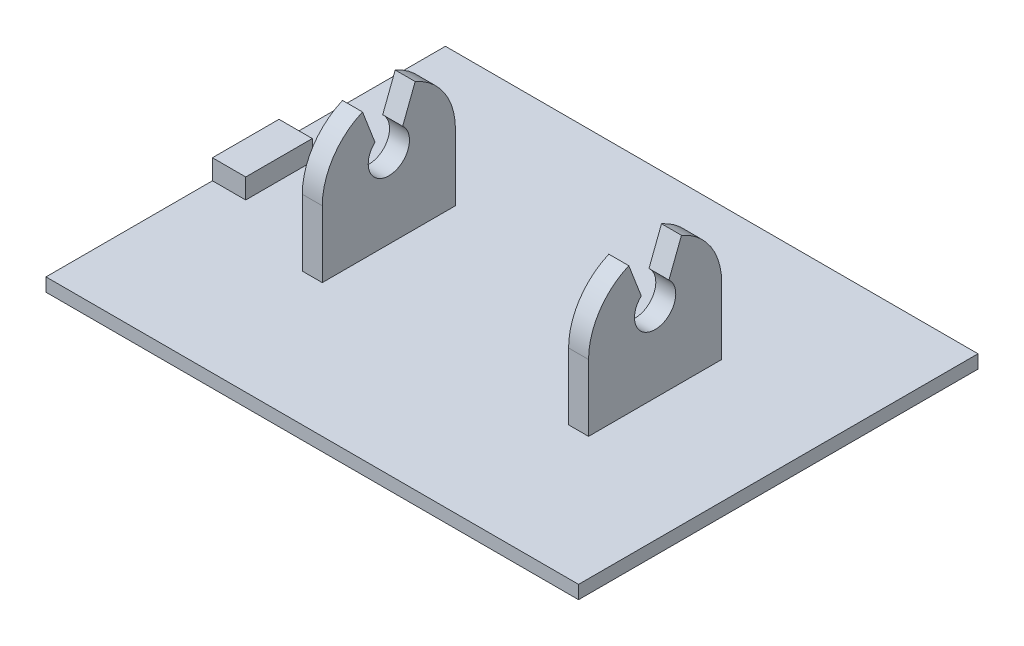
ISO-10303-21;
HEADER;
FILE_DESCRIPTION(('STEP AP214'),'2;1');
FILE_NAME('part.step','',(''),(''),'','','');
FILE_SCHEMA(('AUTOMOTIVE_DESIGN { 1 0 10303 214 1 1 1 1 }'));
ENDSEC;
DATA;
#1=APPLICATION_CONTEXT('core data for automotive mechanical design processes');
#2=APPLICATION_PROTOCOL_DEFINITION('international standard','automotive_design',2000,#1);
#3=PRODUCT_CONTEXT('',#1,'mechanical');
#4=PRODUCT('Part','Part','',(#3));
#5=PRODUCT_RELATED_PRODUCT_CATEGORY('part','',(#4));
#6=PRODUCT_DEFINITION_FORMATION('','',#4);
#7=PRODUCT_DEFINITION_CONTEXT('part definition',#1,'design');
#8=PRODUCT_DEFINITION('design','',#6,#7);
#9=PRODUCT_DEFINITION_SHAPE('','',#8);
#10=(LENGTH_UNIT() NAMED_UNIT(*) SI_UNIT(.MILLI.,.METRE.));
#11=(NAMED_UNIT(*) PLANE_ANGLE_UNIT() SI_UNIT($,.RADIAN.));
#12=(NAMED_UNIT(*) SI_UNIT($,.STERADIAN.) SOLID_ANGLE_UNIT());
#13=UNCERTAINTY_MEASURE_WITH_UNIT(LENGTH_MEASURE(1.E-05),#10,'distance_accuracy_value','');
#14=(GEOMETRIC_REPRESENTATION_CONTEXT(3) GLOBAL_UNCERTAINTY_ASSIGNED_CONTEXT((#13)) GLOBAL_UNIT_ASSIGNED_CONTEXT((#10,
#11,#12)) REPRESENTATION_CONTEXT('',''));
#15=CARTESIAN_POINT('',(0.,0.,0.));
#16=DIRECTION('',(0.,0.,1.));
#17=DIRECTION('',(1.,0.,0.));
#18=AXIS2_PLACEMENT_3D('',#15,#16,#17);
#19=CARTESIAN_POINT('',(0.,2.,0.));
#20=DIRECTION('',(0.,-1.,0.));
#21=DIRECTION('',(0.,0.,-1.));
#22=AXIS2_PLACEMENT_3D('',#19,#20,#21);
#23=PLANE('',#22);
#24=DIRECTION('',(-1.,0.,0.));
#25=VECTOR('',#24,1.);
#26=CARTESIAN_POINT('',(21.5,2.,-10.));
#27=LINE('',#26,#25);
#28=CARTESIAN_POINT('',(21.5,2.,-10.));
#29=VERTEX_POINT('',#28);
#30=CARTESIAN_POINT('',(18.5,2.,-10.));
#31=VERTEX_POINT('',#30);
#32=EDGE_CURVE('E251',#29,#31,#27,.T.);
#33=ORIENTED_EDGE('',*,*,#32,.F.);
#34=DIRECTION('',(0.,0.,1.));
#35=VECTOR('',#34,1.);
#36=CARTESIAN_POINT('',(21.5,2.,-10.));
#37=LINE('',#36,#35);
#38=CARTESIAN_POINT('',(21.5,2.,10.));
#39=VERTEX_POINT('',#38);
#40=EDGE_CURVE('E254',#29,#39,#37,.T.);
#41=ORIENTED_EDGE('',*,*,#40,.T.);
#42=DIRECTION('',(-1.,0.,0.));
#43=VECTOR('',#42,1.);
#44=CARTESIAN_POINT('',(21.5,2.,10.));
#45=LINE('',#44,#43);
#46=CARTESIAN_POINT('',(18.5,2.,10.));
#47=VERTEX_POINT('',#46);
#48=EDGE_CURVE('E257',#39,#47,#45,.T.);
#49=ORIENTED_EDGE('',*,*,#48,.T.);
#50=DIRECTION('',(0.,0.,1.));
#51=VECTOR('',#50,1.);
#52=CARTESIAN_POINT('',(18.5,2.,-10.));
#53=LINE('',#52,#51);
#54=EDGE_CURVE('E260',#31,#47,#53,.T.);
#55=ORIENTED_EDGE('',*,*,#54,.F.);
#56=EDGE_LOOP('',(#33,#41,#49,#55));
#57=FACE_BOUND('',#56,.T.);
#58=DIRECTION('',(0.,0.,1.));
#59=VECTOR('',#58,1.);
#60=CARTESIAN_POINT('',(-21.5,2.,-10.));
#61=LINE('',#60,#59);
#62=CARTESIAN_POINT('',(-21.5,2.,-10.));
#63=VERTEX_POINT('',#62);
#64=CARTESIAN_POINT('',(-21.5,2.,10.));
#65=VERTEX_POINT('',#64);
#66=EDGE_CURVE('E306',#63,#65,#61,.T.);
#67=ORIENTED_EDGE('',*,*,#66,.F.);
#68=DIRECTION('',(1.,0.,0.));
#69=VECTOR('',#68,1.);
#70=CARTESIAN_POINT('',(-21.5,2.,-10.));
#71=LINE('',#70,#69);
#72=CARTESIAN_POINT('',(-18.5,2.,-10.));
#73=VERTEX_POINT('',#72);
#74=EDGE_CURVE('E297',#63,#73,#71,.T.);
#75=ORIENTED_EDGE('',*,*,#74,.T.);
#76=DIRECTION('',(0.,0.,1.));
#77=VECTOR('',#76,1.);
#78=CARTESIAN_POINT('',(-18.5,2.,-10.));
#79=LINE('',#78,#77);
#80=CARTESIAN_POINT('',(-18.5,2.,10.));
#81=VERTEX_POINT('',#80);
#82=EDGE_CURVE('E300',#73,#81,#79,.T.);
#83=ORIENTED_EDGE('',*,*,#82,.T.);
#84=DIRECTION('',(1.,0.,0.));
#85=VECTOR('',#84,1.);
#86=CARTESIAN_POINT('',(-21.5,2.,10.));
#87=LINE('',#86,#85);
#88=EDGE_CURVE('E303',#65,#81,#87,.T.);
#89=ORIENTED_EDGE('',*,*,#88,.F.);
#90=EDGE_LOOP('',(#67,#75,#83,#89));
#91=FACE_BOUND('',#90,.T.);
#92=DIRECTION('',(1.,0.,0.));
#93=VECTOR('',#92,1.);
#94=CARTESIAN_POINT('',(-40.,2.,5.));
#95=LINE('',#94,#93);
#96=CARTESIAN_POINT('',(-40.,2.,5.));
#97=VERTEX_POINT('',#96);
#98=CARTESIAN_POINT('',(-35.,2.,5.));
#99=VERTEX_POINT('',#98);
#100=EDGE_CURVE('E483',#97,#99,#95,.T.);
#101=ORIENTED_EDGE('',*,*,#100,.F.);
#102=DIRECTION('',(0.,0.,-1.));
#103=VECTOR('',#102,1.);
#104=CARTESIAN_POINT('',(-40.,2.,30.));
#105=LINE('',#104,#103);
#106=CARTESIAN_POINT('',(-40.,2.,30.));
#107=VERTEX_POINT('',#106);
#108=EDGE_CURVE('E221',#107,#97,#105,.T.);
#109=ORIENTED_EDGE('',*,*,#108,.F.);
#110=DIRECTION('',(-1.,0.,0.));
#111=VECTOR('',#110,1.);
#112=CARTESIAN_POINT('',(40.,2.,30.));
#113=LINE('',#112,#111);
#114=CARTESIAN_POINT('',(40.,2.,30.));
#115=VERTEX_POINT('',#114);
#116=EDGE_CURVE('E318',#115,#107,#113,.T.);
#117=ORIENTED_EDGE('',*,*,#116,.F.);
#118=DIRECTION('',(0.,0.,-1.));
#119=VECTOR('',#118,1.);
#120=CARTESIAN_POINT('',(40.,2.,30.));
#121=LINE('',#120,#119);
#122=CARTESIAN_POINT('',(40.,2.,-30.));
#123=VERTEX_POINT('',#122);
#124=EDGE_CURVE('E327',#115,#123,#121,.T.);
#125=ORIENTED_EDGE('',*,*,#124,.T.);
#126=DIRECTION('',(-1.,0.,0.));
#127=VECTOR('',#126,1.);
#128=CARTESIAN_POINT('',(40.,2.,-30.));
#129=LINE('',#128,#127);
#130=CARTESIAN_POINT('',(-40.,2.,-30.));
#131=VERTEX_POINT('',#130);
#132=EDGE_CURVE('E324',#123,#131,#129,.T.);
#133=ORIENTED_EDGE('',*,*,#132,.T.);
#134=CARTESIAN_POINT('',(-40.,2.,-5.));
#135=VERTEX_POINT('',#134);
#136=EDGE_CURVE('E321',#135,#131,#105,.T.);
#137=ORIENTED_EDGE('',*,*,#136,.F.);
#138=DIRECTION('',(1.,0.,0.));
#139=VECTOR('',#138,1.);
#140=CARTESIAN_POINT('',(-40.,2.,-5.));
#141=LINE('',#140,#139);
#142=CARTESIAN_POINT('',(-35.,2.,-5.));
#143=VERTEX_POINT('',#142);
#144=EDGE_CURVE('E51',#135,#143,#141,.T.);
#145=ORIENTED_EDGE('',*,*,#144,.T.);
#146=DIRECTION('',(0.,0.,1.));
#147=VECTOR('',#146,1.);
#148=CARTESIAN_POINT('',(-35.,2.,-5.));
#149=LINE('',#148,#147);
#150=EDGE_CURVE('E486',#143,#99,#149,.T.);
#151=ORIENTED_EDGE('',*,*,#150,.T.);
#152=EDGE_LOOP('',(#101,#109,#117,#125,#133,#137,#145,#151));
#153=FACE_BOUND('',#152,.T.);
#154=ADVANCED_FACE('F35',(#57,#91,#153),#23,.F.);
#155=CARTESIAN_POINT('',(21.5,12.,0.));
#156=DIRECTION('',(-1.,0.,0.));
#157=DIRECTION('',(0.,0.,1.));
#158=AXIS2_PLACEMENT_3D('',#155,#156,#157);
#159=CYLINDRICAL_SURFACE('',#158,10.);
#160=CARTESIAN_POINT('',(21.5,12.,0.));
#161=DIRECTION('',(1.,0.,0.));
#162=DIRECTION('',(0.,0.,-1.));
#163=AXIS2_PLACEMENT_3D('',#160,#161,#162);
#164=CIRCLE('',#163,10.);
#165=CARTESIAN_POINT('',(21.5,21.1844239178997,3.95554766073066));
#166=VERTEX_POINT('',#165);
#167=CARTESIAN_POINT('',(21.5,12.,10.));
#168=VERTEX_POINT('',#167);
#169=EDGE_CURVE('E366',#166,#168,#164,.T.);
#170=ORIENTED_EDGE('',*,*,#169,.F.);
#171=DIRECTION('',(-1.,0.,0.));
#172=VECTOR('',#171,1.);
#173=CARTESIAN_POINT('',(21.5,21.1844239178997,3.95554766073066));
#174=LINE('',#173,#172);
#175=CARTESIAN_POINT('',(18.5,21.1844239178997,3.95554766073066));
#176=VERTEX_POINT('',#175);
#177=EDGE_CURVE('E233',#176,#166,#174,.F.);
#178=ORIENTED_EDGE('',*,*,#177,.F.);
#179=CARTESIAN_POINT('',(18.5,12.,0.));
#180=DIRECTION('',(1.,0.,0.));
#181=DIRECTION('',(0.,0.,-1.));
#182=AXIS2_PLACEMENT_3D('',#179,#180,#181);
#183=CIRCLE('',#182,10.);
#184=CARTESIAN_POINT('',(18.5,12.,10.));
#185=VERTEX_POINT('',#184);
#186=EDGE_CURVE('E11',#185,#176,#183,.F.);
#187=ORIENTED_EDGE('',*,*,#186,.F.);
#188=DIRECTION('',(1.,0.,0.));
#189=VECTOR('',#188,1.);
#190=CARTESIAN_POINT('',(21.5,12.,10.));
#191=LINE('',#190,#189);
#192=EDGE_CURVE('E361',#168,#185,#191,.F.);
#193=ORIENTED_EDGE('',*,*,#192,.F.);
#194=EDGE_LOOP('',(#170,#178,#187,#193));
#195=FACE_BOUND('',#194,.T.);
#196=ADVANCED_FACE('F38',(#195),#159,.T.);
#197=CARTESIAN_POINT('',(18.5,21.1844239178997,-3.95554766073066));
#198=VERTEX_POINT('',#197);
#199=CARTESIAN_POINT('',(18.5,12.,-10.));
#200=VERTEX_POINT('',#199);
#201=EDGE_CURVE('E44',#198,#200,#183,.F.);
#202=ORIENTED_EDGE('',*,*,#201,.F.);
#203=DIRECTION('',(-1.,0.,0.));
#204=VECTOR('',#203,1.);
#205=CARTESIAN_POINT('',(21.5,21.1844239178997,-3.95554766073066));
#206=LINE('',#205,#204);
#207=CARTESIAN_POINT('',(21.5,21.1844239178997,-3.95554766073065));
#208=VERTEX_POINT('',#207);
#209=EDGE_CURVE('E231',#208,#198,#206,.T.);
#210=ORIENTED_EDGE('',*,*,#209,.F.);
#211=CARTESIAN_POINT('',(21.5,12.,-10.));
#212=VERTEX_POINT('',#211);
#213=EDGE_CURVE('E367',#212,#208,#164,.T.);
#214=ORIENTED_EDGE('',*,*,#213,.F.);
#215=DIRECTION('',(-1.,0.,0.));
#216=VECTOR('',#215,1.);
#217=CARTESIAN_POINT('',(21.5,12.,-10.));
#218=LINE('',#217,#216);
#219=EDGE_CURVE('E364',#200,#212,#218,.F.);
#220=ORIENTED_EDGE('',*,*,#219,.F.);
#221=EDGE_LOOP('',(#202,#210,#214,#220));
#222=FACE_BOUND('',#221,.T.);
#223=ADVANCED_FACE('F393',(#222),#159,.T.);
#224=CARTESIAN_POINT('',(18.5,22.,-10.));
#225=DIRECTION('',(1.,0.,0.));
#226=DIRECTION('',(0.,0.,-1.));
#227=AXIS2_PLACEMENT_3D('',#224,#225,#226);
#228=PLANE('',#227);
#229=DIRECTION('',(0.,-0.93334560620306,-0.358979079308869));
#230=VECTOR('',#229,1.);
#231=CARTESIAN_POINT('',(18.5,10.9,0.));
#232=LINE('',#231,#230);
#233=CARTESIAN_POINT('',(18.5,16.3010309278351,2.07731958762886));
#234=VERTEX_POINT('',#233);
#235=EDGE_CURVE('E235',#176,#234,#232,.T.);
#236=ORIENTED_EDGE('',*,*,#235,.T.);
#237=CARTESIAN_POINT('',(18.5,14.,0.));
#238=DIRECTION('',(1.,0.,0.));
#239=DIRECTION('',(0.,0.,-1.));
#240=AXIS2_PLACEMENT_3D('',#237,#238,#239);
#241=CIRCLE('',#240,3.1);
#242=CARTESIAN_POINT('',(18.5,16.3010309278351,-2.07731958762887));
#243=VERTEX_POINT('',#242);
#244=EDGE_CURVE('E245',#234,#243,#241,.T.);
#245=ORIENTED_EDGE('',*,*,#244,.T.);
#246=DIRECTION('',(0.,0.93334560620306,-0.358979079308869));
#247=VECTOR('',#246,1.);
#248=CARTESIAN_POINT('',(18.5,23.9,-5.));
#249=LINE('',#248,#247);
#250=EDGE_CURVE('E59',#243,#198,#249,.T.);
#251=ORIENTED_EDGE('',*,*,#250,.T.);
#252=ORIENTED_EDGE('',*,*,#201,.T.);
#253=DIRECTION('',(0.,-1.,0.));
#254=VECTOR('',#253,1.);
#255=CARTESIAN_POINT('',(18.5,22.,-10.));
#256=LINE('',#255,#254);
#257=EDGE_CURVE('E264',#200,#31,#256,.T.);
#258=ORIENTED_EDGE('',*,*,#257,.T.);
#259=ORIENTED_EDGE('',*,*,#54,.T.);
#260=DIRECTION('',(0.,-1.,0.));
#261=VECTOR('',#260,1.);
#262=CARTESIAN_POINT('',(18.5,22.,10.));
#263=LINE('',#262,#261);
#264=EDGE_CURVE('E267',#185,#47,#263,.T.);
#265=ORIENTED_EDGE('',*,*,#264,.F.);
#266=ORIENTED_EDGE('',*,*,#186,.T.);
#267=EDGE_LOOP('',(#236,#245,#251,#252,#258,#259,#265,#266));
#268=FACE_BOUND('',#267,.T.);
#269=ADVANCED_FACE('F397',(#268),#228,.F.);
#270=CARTESIAN_POINT('',(21.5,22.,-10.));
#271=DIRECTION('',(1.,0.,0.));
#272=DIRECTION('',(0.,0.,-1.));
#273=AXIS2_PLACEMENT_3D('',#270,#271,#272);
#274=PLANE('',#273);
#275=CARTESIAN_POINT('',(21.5,14.,0.));
#276=DIRECTION('',(1.,0.,0.));
#277=DIRECTION('',(0.,0.,-1.));
#278=AXIS2_PLACEMENT_3D('',#275,#276,#277);
#279=CIRCLE('',#278,3.1);
#280=CARTESIAN_POINT('',(21.5,16.3010309278351,2.07731958762887));
#281=VERTEX_POINT('',#280);
#282=CARTESIAN_POINT('',(21.5,16.3010309278351,-2.07731958762886));
#283=VERTEX_POINT('',#282);
#284=EDGE_CURVE('E248',#281,#283,#279,.T.);
#285=ORIENTED_EDGE('',*,*,#284,.F.);
#286=DIRECTION('',(0.,0.93334560620306,0.358979079308869));
#287=VECTOR('',#286,1.);
#288=CARTESIAN_POINT('',(21.5,10.9,0.));
#289=LINE('',#288,#287);
#290=EDGE_CURVE('E238',#281,#166,#289,.T.);
#291=ORIENTED_EDGE('',*,*,#290,.T.);
#292=ORIENTED_EDGE('',*,*,#169,.T.);
#293=DIRECTION('',(0.,-1.,0.));
#294=VECTOR('',#293,1.);
#295=CARTESIAN_POINT('',(21.5,22.,10.));
#296=LINE('',#295,#294);
#297=EDGE_CURVE('E269',#168,#39,#296,.T.);
#298=ORIENTED_EDGE('',*,*,#297,.T.);
#299=ORIENTED_EDGE('',*,*,#40,.F.);
#300=DIRECTION('',(0.,-1.,0.));
#301=VECTOR('',#300,1.);
#302=CARTESIAN_POINT('',(21.5,22.,-10.));
#303=LINE('',#302,#301);
#304=EDGE_CURVE('E263',#212,#29,#303,.T.);
#305=ORIENTED_EDGE('',*,*,#304,.F.);
#306=ORIENTED_EDGE('',*,*,#213,.T.);
#307=DIRECTION('',(0.,-0.93334560620306,0.358979079308869));
#308=VECTOR('',#307,1.);
#309=CARTESIAN_POINT('',(21.5,23.9,-5.));
#310=LINE('',#309,#308);
#311=EDGE_CURVE('E241',#208,#283,#310,.T.);
#312=ORIENTED_EDGE('',*,*,#311,.T.);
#313=EDGE_LOOP('',(#285,#291,#292,#298,#299,#305,#306,#312));
#314=FACE_BOUND('',#313,.T.);
#315=ADVANCED_FACE('F374',(#314),#274,.T.);
#316=CARTESIAN_POINT('',(40.001,14.,0.));
#317=DIRECTION('',(-1.,0.,0.));
#318=DIRECTION('',(0.,0.,1.));
#319=AXIS2_PLACEMENT_3D('',#316,#317,#318);
#320=CYLINDRICAL_SURFACE('',#319,3.1);
#321=ORIENTED_EDGE('',*,*,#244,.F.);
#322=DIRECTION('',(-1.,0.,0.));
#323=VECTOR('',#322,1.);
#324=CARTESIAN_POINT('',(40.001,16.3010309278351,2.07731958762887));
#325=LINE('',#324,#323);
#326=EDGE_CURVE('E224',#281,#234,#325,.T.);
#327=ORIENTED_EDGE('',*,*,#326,.F.);
#328=ORIENTED_EDGE('',*,*,#284,.T.);
#329=DIRECTION('',(-1.,0.,0.));
#330=VECTOR('',#329,1.);
#331=CARTESIAN_POINT('',(40.001,16.3010309278351,-2.07731958762886));
#332=LINE('',#331,#330);
#333=EDGE_CURVE('E222',#243,#283,#332,.F.);
#334=ORIENTED_EDGE('',*,*,#333,.F.);
#335=EDGE_LOOP('',(#321,#327,#328,#334));
#336=FACE_BOUND('',#335,.T.);
#337=ADVANCED_FACE('F401',(#336),#320,.F.);
#338=CARTESIAN_POINT('',(-18.5,12.,0.));
#339=DIRECTION('',(1.,0.,0.));
#340=DIRECTION('',(0.,0.,-1.));
#341=AXIS2_PLACEMENT_3D('',#338,#339,#340);
#342=CYLINDRICAL_SURFACE('',#341,10.);
#343=DIRECTION('',(1.,0.,0.));
#344=VECTOR('',#343,1.);
#345=CARTESIAN_POINT('',(-18.5,21.1844239178997,3.95554766073066));
#346=LINE('',#345,#344);
#347=CARTESIAN_POINT('',(-18.5,21.1844239178997,3.95554766073066));
#348=VERTEX_POINT('',#347);
#349=CARTESIAN_POINT('',(-21.5,21.1844239178997,3.95554766073066));
#350=VERTEX_POINT('',#349);
#351=EDGE_CURVE('E278',#348,#350,#346,.F.);
#352=ORIENTED_EDGE('',*,*,#351,.T.);
#353=CARTESIAN_POINT('',(-21.5,12.,0.));
#354=DIRECTION('',(1.,0.,0.));
#355=DIRECTION('',(0.,0.,-1.));
#356=AXIS2_PLACEMENT_3D('',#353,#354,#355);
#357=CIRCLE('',#356,10.);
#358=CARTESIAN_POINT('',(-21.5,12.,10.));
#359=VERTEX_POINT('',#358);
#360=EDGE_CURVE('E358',#359,#350,#357,.F.);
#361=ORIENTED_EDGE('',*,*,#360,.F.);
#362=DIRECTION('',(1.,0.,0.));
#363=VECTOR('',#362,1.);
#364=CARTESIAN_POINT('',(-21.5,12.,10.));
#365=LINE('',#364,#363);
#366=CARTESIAN_POINT('',(-18.5,12.,10.));
#367=VERTEX_POINT('',#366);
#368=EDGE_CURVE('E341',#367,#359,#365,.F.);
#369=ORIENTED_EDGE('',*,*,#368,.F.);
#370=CARTESIAN_POINT('',(-18.5,12.,0.));
#371=DIRECTION('',(1.,0.,0.));
#372=DIRECTION('',(0.,0.,-1.));
#373=AXIS2_PLACEMENT_3D('',#370,#371,#372);
#374=CIRCLE('',#373,10.);
#375=EDGE_CURVE('E353',#348,#367,#374,.T.);
#376=ORIENTED_EDGE('',*,*,#375,.F.);
#377=EDGE_LOOP('',(#352,#361,#369,#376));
#378=FACE_BOUND('',#377,.T.);
#379=ADVANCED_FACE('F445',(#378),#342,.T.);
#380=DIRECTION('',(1.,0.,0.));
#381=VECTOR('',#380,1.);
#382=CARTESIAN_POINT('',(-18.5,21.1844239178997,-3.95554766073065));
#383=LINE('',#382,#381);
#384=CARTESIAN_POINT('',(-21.5,21.1844239178997,-3.95554766073065));
#385=VERTEX_POINT('',#384);
#386=CARTESIAN_POINT('',(-18.5,21.1844239178997,-3.95554766073066));
#387=VERTEX_POINT('',#386);
#388=EDGE_CURVE('E275',#385,#387,#383,.T.);
#389=ORIENTED_EDGE('',*,*,#388,.T.);
#390=CARTESIAN_POINT('',(-18.5,12.,-10.));
#391=VERTEX_POINT('',#390);
#392=EDGE_CURVE('E354',#391,#387,#374,.T.);
#393=ORIENTED_EDGE('',*,*,#392,.F.);
#394=DIRECTION('',(-1.,0.,0.));
#395=VECTOR('',#394,1.);
#396=CARTESIAN_POINT('',(-18.5,12.,-10.));
#397=LINE('',#396,#395);
#398=CARTESIAN_POINT('',(-21.5,12.,-10.));
#399=VERTEX_POINT('',#398);
#400=EDGE_CURVE('E350',#399,#391,#397,.F.);
#401=ORIENTED_EDGE('',*,*,#400,.F.);
#402=EDGE_CURVE('E357',#385,#399,#357,.F.);
#403=ORIENTED_EDGE('',*,*,#402,.F.);
#404=EDGE_LOOP('',(#389,#393,#401,#403));
#405=FACE_BOUND('',#404,.T.);
#406=ADVANCED_FACE('F439',(#405),#342,.T.);
#407=CARTESIAN_POINT('',(40.,2.,30.));
#408=DIRECTION('',(0.,0.,1.));
#409=DIRECTION('',(1.,0.,0.));
#410=AXIS2_PLACEMENT_3D('',#407,#408,#409);
#411=PLANE('',#410);
#412=DIRECTION('',(-1.,0.,0.));
#413=VECTOR('',#412,1.);
#414=CARTESIAN_POINT('',(40.,0.,30.));
#415=LINE('',#414,#413);
#416=CARTESIAN_POINT('',(40.,0.,30.));
#417=VERTEX_POINT('',#416);
#418=CARTESIAN_POINT('',(-40.,0.,30.));
#419=VERTEX_POINT('',#418);
#420=EDGE_CURVE('E312',#417,#419,#415,.T.);
#421=ORIENTED_EDGE('',*,*,#420,.F.);
#422=DIRECTION('',(0.,-1.,0.));
#423=VECTOR('',#422,1.);
#424=CARTESIAN_POINT('',(40.,2.,30.));
#425=LINE('',#424,#423);
#426=EDGE_CURVE('E339',#115,#417,#425,.T.);
#427=ORIENTED_EDGE('',*,*,#426,.F.);
#428=ORIENTED_EDGE('',*,*,#116,.T.);
#429=DIRECTION('',(0.,-1.,0.));
#430=VECTOR('',#429,1.);
#431=CARTESIAN_POINT('',(-40.,2.,30.));
#432=LINE('',#431,#430);
#433=EDGE_CURVE('E329',#107,#419,#432,.T.);
#434=ORIENTED_EDGE('',*,*,#433,.T.);
#435=EDGE_LOOP('',(#421,#427,#428,#434));
#436=FACE_BOUND('',#435,.T.);
#437=ADVANCED_FACE('F431',(#436),#411,.T.);
#438=CARTESIAN_POINT('',(40.,2.,30.));
#439=DIRECTION('',(-1.,0.,0.));
#440=DIRECTION('',(0.,0.,1.));
#441=AXIS2_PLACEMENT_3D('',#438,#439,#440);
#442=PLANE('',#441);
#443=DIRECTION('',(0.,0.,-1.));
#444=VECTOR('',#443,1.);
#445=CARTESIAN_POINT('',(40.,0.,30.));
#446=LINE('',#445,#444);
#447=CARTESIAN_POINT('',(40.,0.,-30.));
#448=VERTEX_POINT('',#447);
#449=EDGE_CURVE('E322',#417,#448,#446,.T.);
#450=ORIENTED_EDGE('',*,*,#449,.T.);
#451=DIRECTION('',(0.,-1.,0.));
#452=VECTOR('',#451,1.);
#453=CARTESIAN_POINT('',(40.,2.,-30.));
#454=LINE('',#453,#452);
#455=EDGE_CURVE('E342',#123,#448,#454,.T.);
#456=ORIENTED_EDGE('',*,*,#455,.F.);
#457=ORIENTED_EDGE('',*,*,#124,.F.);
#458=ORIENTED_EDGE('',*,*,#426,.T.);
#459=EDGE_LOOP('',(#450,#456,#457,#458));
#460=FACE_BOUND('',#459,.T.);
#461=ADVANCED_FACE('F427',(#460),#442,.F.);
#462=CARTESIAN_POINT('',(40.,2.,-30.));
#463=DIRECTION('',(0.,0.,1.));
#464=DIRECTION('',(1.,0.,0.));
#465=AXIS2_PLACEMENT_3D('',#462,#463,#464);
#466=PLANE('',#465);
#467=DIRECTION('',(-1.,0.,0.));
#468=VECTOR('',#467,1.);
#469=CARTESIAN_POINT('',(40.,0.,-30.));
#470=LINE('',#469,#468);
#471=CARTESIAN_POINT('',(-40.,0.,-30.));
#472=VERTEX_POINT('',#471);
#473=EDGE_CURVE('E335',#448,#472,#470,.T.);
#474=ORIENTED_EDGE('',*,*,#473,.T.);
#475=DIRECTION('',(0.,-1.,0.));
#476=VECTOR('',#475,1.);
#477=CARTESIAN_POINT('',(-40.,2.,-30.));
#478=LINE('',#477,#476);
#479=EDGE_CURVE('E345',#131,#472,#478,.T.);
#480=ORIENTED_EDGE('',*,*,#479,.F.);
#481=ORIENTED_EDGE('',*,*,#132,.F.);
#482=ORIENTED_EDGE('',*,*,#455,.T.);
#483=EDGE_LOOP('',(#474,#480,#481,#482));
#484=FACE_BOUND('',#483,.T.);
#485=ADVANCED_FACE('F430',(#484),#466,.F.);
#486=CARTESIAN_POINT('',(-40.,2.,30.));
#487=DIRECTION('',(-1.,0.,0.));
#488=DIRECTION('',(0.,0.,1.));
#489=AXIS2_PLACEMENT_3D('',#486,#487,#488);
#490=PLANE('',#489);
#491=DIRECTION('',(0.,0.,-1.));
#492=VECTOR('',#491,1.);
#493=CARTESIAN_POINT('',(-40.,0.,30.));
#494=LINE('',#493,#492);
#495=EDGE_CURVE('E332',#419,#472,#494,.T.);
#496=ORIENTED_EDGE('',*,*,#495,.F.);
#497=ORIENTED_EDGE('',*,*,#433,.F.);
#498=ORIENTED_EDGE('',*,*,#108,.T.);
#499=DIRECTION('',(0.,-1.,0.));
#500=VECTOR('',#499,1.);
#501=CARTESIAN_POINT('',(-40.,5.,5.));
#502=LINE('',#501,#500);
#503=CARTESIAN_POINT('',(-40.,5.,5.));
#504=VERTEX_POINT('',#503);
#505=EDGE_CURVE('E201',#504,#97,#502,.T.);
#506=ORIENTED_EDGE('',*,*,#505,.F.);
#507=DIRECTION('',(0.,0.,1.));
#508=VECTOR('',#507,1.);
#509=CARTESIAN_POINT('',(-40.,5.,-5.));
#510=LINE('',#509,#508);
#511=CARTESIAN_POINT('',(-40.,5.,-5.));
#512=VERTEX_POINT('',#511);
#513=EDGE_CURVE('E208',#512,#504,#510,.T.);
#514=ORIENTED_EDGE('',*,*,#513,.F.);
#515=DIRECTION('',(0.,-1.,0.));
#516=VECTOR('',#515,1.);
#517=CARTESIAN_POINT('',(-40.,5.,-5.));
#518=LINE('',#517,#516);
#519=EDGE_CURVE('E493',#512,#135,#518,.T.);
#520=ORIENTED_EDGE('',*,*,#519,.T.);
#521=ORIENTED_EDGE('',*,*,#136,.T.);
#522=ORIENTED_EDGE('',*,*,#479,.T.);
#523=EDGE_LOOP('',(#496,#497,#498,#506,#514,#520,#521,#522));
#524=FACE_BOUND('',#523,.T.);
#525=ADVANCED_FACE('F219',(#524),#490,.T.);
#526=CARTESIAN_POINT('',(0.,0.,0.));
#527=DIRECTION('',(0.,-1.,0.));
#528=DIRECTION('',(0.,0.,-1.));
#529=AXIS2_PLACEMENT_3D('',#526,#527,#528);
#530=PLANE('',#529);
#531=ORIENTED_EDGE('',*,*,#420,.T.);
#532=ORIENTED_EDGE('',*,*,#495,.T.);
#533=ORIENTED_EDGE('',*,*,#473,.F.);
#534=ORIENTED_EDGE('',*,*,#449,.F.);
#535=EDGE_LOOP('',(#531,#532,#533,#534));
#536=FACE_BOUND('',#535,.T.);
#537=ADVANCED_FACE('F423',(#536),#530,.T.);
#538=CARTESIAN_POINT('',(-21.5,22.,-10.));
#539=DIRECTION('',(0.,0.,-1.));
#540=DIRECTION('',(-1.,0.,0.));
#541=AXIS2_PLACEMENT_3D('',#538,#539,#540);
#542=PLANE('',#541);
#543=DIRECTION('',(0.,-1.,0.));
#544=VECTOR('',#543,1.);
#545=CARTESIAN_POINT('',(-21.5,22.,-10.));
#546=LINE('',#545,#544);
#547=EDGE_CURVE('E310',#399,#63,#546,.T.);
#548=ORIENTED_EDGE('',*,*,#547,.F.);
#549=ORIENTED_EDGE('',*,*,#400,.T.);
#550=DIRECTION('',(0.,-1.,0.));
#551=VECTOR('',#550,1.);
#552=CARTESIAN_POINT('',(-18.5,22.,-10.));
#553=LINE('',#552,#551);
#554=EDGE_CURVE('E309',#391,#73,#553,.T.);
#555=ORIENTED_EDGE('',*,*,#554,.T.);
#556=ORIENTED_EDGE('',*,*,#74,.F.);
#557=EDGE_LOOP('',(#548,#549,#555,#556));
#558=FACE_BOUND('',#557,.T.);
#559=ADVANCED_FACE('F421',(#558),#542,.T.);
#560=CARTESIAN_POINT('',(-21.5,22.,-10.));
#561=DIRECTION('',(1.,0.,0.));
#562=DIRECTION('',(0.,0.,-1.));
#563=AXIS2_PLACEMENT_3D('',#560,#561,#562);
#564=PLANE('',#563);
#565=ORIENTED_EDGE('',*,*,#360,.T.);
#566=DIRECTION('',(0.,0.93334560620306,0.358979079308869));
#567=VECTOR('',#566,1.);
#568=CARTESIAN_POINT('',(-21.5,10.9,0.));
#569=LINE('',#568,#567);
#570=CARTESIAN_POINT('',(-21.5,16.3010309278351,2.07731958762887));
#571=VERTEX_POINT('',#570);
#572=EDGE_CURVE('E284',#571,#350,#569,.T.);
#573=ORIENTED_EDGE('',*,*,#572,.F.);
#574=CARTESIAN_POINT('',(-21.5,14.,0.));
#575=DIRECTION('',(1.,0.,0.));
#576=DIRECTION('',(0.,0.,-1.));
#577=AXIS2_PLACEMENT_3D('',#574,#575,#576);
#578=CIRCLE('',#577,3.1);
#579=CARTESIAN_POINT('',(-21.5,16.3010309278351,-2.07731958762887));
#580=VERTEX_POINT('',#579);
#581=EDGE_CURVE('E294',#580,#571,#578,.F.);
#582=ORIENTED_EDGE('',*,*,#581,.F.);
#583=DIRECTION('',(0.,-0.93334560620306,0.358979079308869));
#584=VECTOR('',#583,1.);
#585=CARTESIAN_POINT('',(-21.5,23.9,-5.));
#586=LINE('',#585,#584);
#587=EDGE_CURVE('E286',#385,#580,#586,.T.);
#588=ORIENTED_EDGE('',*,*,#587,.F.);
#589=ORIENTED_EDGE('',*,*,#402,.T.);
#590=ORIENTED_EDGE('',*,*,#547,.T.);
#591=ORIENTED_EDGE('',*,*,#66,.T.);
#592=DIRECTION('',(0.,-1.,0.));
#593=VECTOR('',#592,1.);
#594=CARTESIAN_POINT('',(-21.5,22.,10.));
#595=LINE('',#594,#593);
#596=EDGE_CURVE('E313',#359,#65,#595,.T.);
#597=ORIENTED_EDGE('',*,*,#596,.F.);
#598=EDGE_LOOP('',(#565,#573,#582,#588,#589,#590,#591,#597));
#599=FACE_BOUND('',#598,.T.);
#600=ADVANCED_FACE('F465',(#599),#564,.F.);
#601=CARTESIAN_POINT('',(-21.5,22.,10.));
#602=DIRECTION('',(0.,0.,-1.));
#603=DIRECTION('',(-1.,0.,0.));
#604=AXIS2_PLACEMENT_3D('',#601,#602,#603);
#605=PLANE('',#604);
#606=DIRECTION('',(0.,-1.,0.));
#607=VECTOR('',#606,1.);
#608=CARTESIAN_POINT('',(-18.5,22.,10.));
#609=LINE('',#608,#607);
#610=EDGE_CURVE('E315',#367,#81,#609,.T.);
#611=ORIENTED_EDGE('',*,*,#610,.F.);
#612=ORIENTED_EDGE('',*,*,#368,.T.);
#613=ORIENTED_EDGE('',*,*,#596,.T.);
#614=ORIENTED_EDGE('',*,*,#88,.T.);
#615=EDGE_LOOP('',(#611,#612,#613,#614));
#616=FACE_BOUND('',#615,.T.);
#617=ADVANCED_FACE('F480',(#616),#605,.F.);
#618=CARTESIAN_POINT('',(-18.5,22.,-10.));
#619=DIRECTION('',(1.,0.,0.));
#620=DIRECTION('',(0.,0.,-1.));
#621=AXIS2_PLACEMENT_3D('',#618,#619,#620);
#622=PLANE('',#621);
#623=DIRECTION('',(0.,0.93334560620306,0.358979079308869));
#624=VECTOR('',#623,1.);
#625=CARTESIAN_POINT('',(-18.5,10.9,0.));
#626=LINE('',#625,#624);
#627=CARTESIAN_POINT('',(-18.5,16.3010309278351,2.07731958762886));
#628=VERTEX_POINT('',#627);
#629=EDGE_CURVE('E281',#628,#348,#626,.T.);
#630=ORIENTED_EDGE('',*,*,#629,.T.);
#631=ORIENTED_EDGE('',*,*,#375,.T.);
#632=ORIENTED_EDGE('',*,*,#610,.T.);
#633=ORIENTED_EDGE('',*,*,#82,.F.);
#634=ORIENTED_EDGE('',*,*,#554,.F.);
#635=ORIENTED_EDGE('',*,*,#392,.T.);
#636=DIRECTION('',(0.,-0.93334560620306,0.358979079308869));
#637=VECTOR('',#636,1.);
#638=CARTESIAN_POINT('',(-18.5,23.9,-5.));
#639=LINE('',#638,#637);
#640=CARTESIAN_POINT('',(-18.5,16.3010309278351,-2.07731958762887));
#641=VERTEX_POINT('',#640);
#642=EDGE_CURVE('E288',#387,#641,#639,.T.);
#643=ORIENTED_EDGE('',*,*,#642,.T.);
#644=CARTESIAN_POINT('',(-18.5,14.,0.));
#645=DIRECTION('',(1.,0.,0.));
#646=DIRECTION('',(0.,0.,-1.));
#647=AXIS2_PLACEMENT_3D('',#644,#645,#646);
#648=CIRCLE('',#647,3.1);
#649=EDGE_CURVE('E291',#628,#641,#648,.T.);
#650=ORIENTED_EDGE('',*,*,#649,.F.);
#651=EDGE_LOOP('',(#630,#631,#632,#633,#634,#635,#643,#650));
#652=FACE_BOUND('',#651,.T.);
#653=ADVANCED_FACE('F457',(#652),#622,.T.);
#654=CARTESIAN_POINT('',(-40.001,14.,0.));
#655=DIRECTION('',(1.,0.,0.));
#656=DIRECTION('',(0.,0.,-1.));
#657=AXIS2_PLACEMENT_3D('',#654,#655,#656);
#658=CYLINDRICAL_SURFACE('',#657,3.1);
#659=ORIENTED_EDGE('',*,*,#581,.T.);
#660=DIRECTION('',(1.,0.,0.));
#661=VECTOR('',#660,1.);
#662=CARTESIAN_POINT('',(-40.001,16.3010309278351,2.07731958762887));
#663=LINE('',#662,#661);
#664=EDGE_CURVE('E273',#628,#571,#663,.F.);
#665=ORIENTED_EDGE('',*,*,#664,.F.);
#666=ORIENTED_EDGE('',*,*,#649,.T.);
#667=DIRECTION('',(1.,0.,0.));
#668=VECTOR('',#667,1.);
#669=CARTESIAN_POINT('',(-40.001,16.3010309278351,-2.07731958762886));
#670=LINE('',#669,#668);
#671=EDGE_CURVE('E266',#580,#641,#670,.T.);
#672=ORIENTED_EDGE('',*,*,#671,.F.);
#673=EDGE_LOOP('',(#659,#665,#666,#672));
#674=FACE_BOUND('',#673,.T.);
#675=ADVANCED_FACE('F473',(#674),#658,.F.);
#676=CARTESIAN_POINT('',(40.001,23.9,-5.));
#677=DIRECTION('',(0.,-0.358979079308869,-0.93334560620306));
#678=DIRECTION('',(0.,0.93334560620306,-0.358979079308869));
#679=AXIS2_PLACEMENT_3D('',#676,#677,#678);
#680=PLANE('',#679);
#681=ORIENTED_EDGE('',*,*,#587,.T.);
#682=ORIENTED_EDGE('',*,*,#671,.T.);
#683=ORIENTED_EDGE('',*,*,#642,.F.);
#684=ORIENTED_EDGE('',*,*,#388,.F.);
#685=EDGE_LOOP('',(#681,#682,#683,#684));
#686=FACE_BOUND('',#685,.T.);
#687=ADVANCED_FACE('F471',(#686),#680,.F.);
#688=CARTESIAN_POINT('',(40.001,10.9,0.));
#689=DIRECTION('',(0.,-0.358979079308869,0.93334560620306));
#690=DIRECTION('',(0.,-0.93334560620306,-0.358979079308869));
#691=AXIS2_PLACEMENT_3D('',#688,#689,#690);
#692=PLANE('',#691);
#693=ORIENTED_EDGE('',*,*,#629,.F.);
#694=ORIENTED_EDGE('',*,*,#664,.T.);
#695=ORIENTED_EDGE('',*,*,#572,.T.);
#696=ORIENTED_EDGE('',*,*,#351,.F.);
#697=EDGE_LOOP('',(#693,#694,#695,#696));
#698=FACE_BOUND('',#697,.T.);
#699=ADVANCED_FACE('F568',(#698),#692,.F.);
#700=CARTESIAN_POINT('',(21.5,22.,-10.));
#701=DIRECTION('',(0.,0.,1.));
#702=DIRECTION('',(1.,0.,0.));
#703=AXIS2_PLACEMENT_3D('',#700,#701,#702);
#704=PLANE('',#703);
#705=ORIENTED_EDGE('',*,*,#257,.F.);
#706=ORIENTED_EDGE('',*,*,#219,.T.);
#707=ORIENTED_EDGE('',*,*,#304,.T.);
#708=ORIENTED_EDGE('',*,*,#32,.T.);
#709=EDGE_LOOP('',(#705,#706,#707,#708));
#710=FACE_BOUND('',#709,.T.);
#711=ADVANCED_FACE('F389',(#710),#704,.F.);
#712=CARTESIAN_POINT('',(21.5,22.,10.));
#713=DIRECTION('',(0.,0.,1.));
#714=DIRECTION('',(1.,0.,0.));
#715=AXIS2_PLACEMENT_3D('',#712,#713,#714);
#716=PLANE('',#715);
#717=ORIENTED_EDGE('',*,*,#297,.F.);
#718=ORIENTED_EDGE('',*,*,#192,.T.);
#719=ORIENTED_EDGE('',*,*,#264,.T.);
#720=ORIENTED_EDGE('',*,*,#48,.F.);
#721=EDGE_LOOP('',(#717,#718,#719,#720));
#722=FACE_BOUND('',#721,.T.);
#723=ADVANCED_FACE('F382',(#722),#716,.T.);
#724=CARTESIAN_POINT('',(-40.001,23.9,-5.));
#725=DIRECTION('',(0.,0.358979079308869,0.93334560620306));
#726=DIRECTION('',(0.,-0.93334560620306,0.358979079308869));
#727=AXIS2_PLACEMENT_3D('',#724,#725,#726);
#728=PLANE('',#727);
#729=ORIENTED_EDGE('',*,*,#209,.T.);
#730=ORIENTED_EDGE('',*,*,#250,.F.);
#731=ORIENTED_EDGE('',*,*,#333,.T.);
#732=ORIENTED_EDGE('',*,*,#311,.F.);
#733=EDGE_LOOP('',(#729,#730,#731,#732));
#734=FACE_BOUND('',#733,.T.);
#735=ADVANCED_FACE('F395',(#734),#728,.T.);
#736=CARTESIAN_POINT('',(-40.001,10.9,0.));
#737=DIRECTION('',(0.,0.358979079308869,-0.93334560620306));
#738=DIRECTION('',(0.,0.93334560620306,0.358979079308869));
#739=AXIS2_PLACEMENT_3D('',#736,#737,#738);
#740=PLANE('',#739);
#741=ORIENTED_EDGE('',*,*,#177,.T.);
#742=ORIENTED_EDGE('',*,*,#290,.F.);
#743=ORIENTED_EDGE('',*,*,#326,.T.);
#744=ORIENTED_EDGE('',*,*,#235,.F.);
#745=EDGE_LOOP('',(#741,#742,#743,#744));
#746=FACE_BOUND('',#745,.T.);
#747=ADVANCED_FACE('F403',(#746),#740,.T.);
#748=CARTESIAN_POINT('',(-40.,5.,5.));
#749=DIRECTION('',(0.,0.,-1.));
#750=DIRECTION('',(-1.,0.,0.));
#751=AXIS2_PLACEMENT_3D('',#748,#749,#750);
#752=PLANE('',#751);
#753=ORIENTED_EDGE('',*,*,#100,.T.);
#754=DIRECTION('',(0.,-1.,0.));
#755=VECTOR('',#754,1.);
#756=CARTESIAN_POINT('',(-35.,5.,5.));
#757=LINE('',#756,#755);
#758=CARTESIAN_POINT('',(-35.,5.,5.));
#759=VERTEX_POINT('',#758);
#760=EDGE_CURVE('E203',#759,#99,#757,.T.);
#761=ORIENTED_EDGE('',*,*,#760,.F.);
#762=DIRECTION('',(1.,0.,0.));
#763=VECTOR('',#762,1.);
#764=CARTESIAN_POINT('',(-40.,5.,5.));
#765=LINE('',#764,#763);
#766=EDGE_CURVE('E196',#504,#759,#765,.T.);
#767=ORIENTED_EDGE('',*,*,#766,.F.);
#768=ORIENTED_EDGE('',*,*,#505,.T.);
#769=EDGE_LOOP('',(#753,#761,#767,#768));
#770=FACE_BOUND('',#769,.T.);
#771=ADVANCED_FACE('F199',(#770),#752,.F.);
#772=CARTESIAN_POINT('',(-35.,5.,-5.));
#773=DIRECTION('',(1.,0.,0.));
#774=DIRECTION('',(0.,0.,-1.));
#775=AXIS2_PLACEMENT_3D('',#772,#773,#774);
#776=PLANE('',#775);
#777=ORIENTED_EDGE('',*,*,#150,.F.);
#778=DIRECTION('',(0.,-1.,0.));
#779=VECTOR('',#778,1.);
#780=CARTESIAN_POINT('',(-35.,5.,-5.));
#781=LINE('',#780,#779);
#782=CARTESIAN_POINT('',(-35.,5.,-5.));
#783=VERTEX_POINT('',#782);
#784=EDGE_CURVE('E226',#783,#143,#781,.T.);
#785=ORIENTED_EDGE('',*,*,#784,.F.);
#786=DIRECTION('',(0.,0.,1.));
#787=VECTOR('',#786,1.);
#788=CARTESIAN_POINT('',(-35.,5.,-5.));
#789=LINE('',#788,#787);
#790=EDGE_CURVE('E207',#783,#759,#789,.T.);
#791=ORIENTED_EDGE('',*,*,#790,.T.);
#792=ORIENTED_EDGE('',*,*,#760,.T.);
#793=EDGE_LOOP('',(#777,#785,#791,#792));
#794=FACE_BOUND('',#793,.T.);
#795=ADVANCED_FACE('F410',(#794),#776,.T.);
#796=CARTESIAN_POINT('',(-40.,5.,-5.));
#797=DIRECTION('',(0.,0.,-1.));
#798=DIRECTION('',(-1.,0.,0.));
#799=AXIS2_PLACEMENT_3D('',#796,#797,#798);
#800=PLANE('',#799);
#801=ORIENTED_EDGE('',*,*,#144,.F.);
#802=ORIENTED_EDGE('',*,*,#519,.F.);
#803=DIRECTION('',(1.,0.,0.));
#804=VECTOR('',#803,1.);
#805=CARTESIAN_POINT('',(-40.,5.,-5.));
#806=LINE('',#805,#804);
#807=EDGE_CURVE('E214',#512,#783,#806,.T.);
#808=ORIENTED_EDGE('',*,*,#807,.T.);
#809=ORIENTED_EDGE('',*,*,#784,.T.);
#810=EDGE_LOOP('',(#801,#802,#808,#809));
#811=FACE_BOUND('',#810,.T.);
#812=ADVANCED_FACE('F494',(#811),#800,.T.);
#813=CARTESIAN_POINT('',(0.,5.,0.));
#814=DIRECTION('',(0.,1.,0.));
#815=DIRECTION('',(0.,0.,1.));
#816=AXIS2_PLACEMENT_3D('',#813,#814,#815);
#817=PLANE('',#816);
#818=ORIENTED_EDGE('',*,*,#513,.T.);
#819=ORIENTED_EDGE('',*,*,#766,.T.);
#820=ORIENTED_EDGE('',*,*,#790,.F.);
#821=ORIENTED_EDGE('',*,*,#807,.F.);
#822=EDGE_LOOP('',(#818,#819,#820,#821));
#823=FACE_BOUND('',#822,.T.);
#824=ADVANCED_FACE('F212',(#823),#817,.T.);
#825=CLOSED_SHELL('',(#154,#196,#223,#269,#315,#337,#379,#406,#437,#461,#485,#525,#537,#559,
#600,#617,#653,#675,#687,#699,#711,#723,#735,#747,#771,#795,#812,#824));
#826=MANIFOLD_SOLID_BREP('B2',#825);
#827=ADVANCED_BREP_SHAPE_REPRESENTATION('',(#18,#826),#14);
#828=SHAPE_DEFINITION_REPRESENTATION(#9,#827);
ENDSEC;
END-ISO-10303-21;
